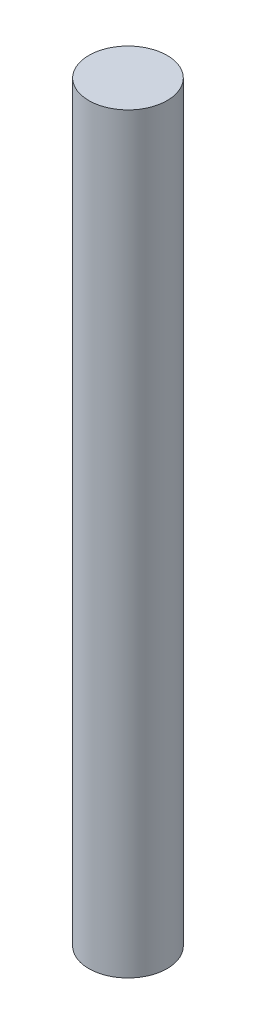
ISO-10303-21;
HEADER;
FILE_DESCRIPTION(('STEP AP214'),'2;1');
FILE_NAME('part.step','',(''),(''),'','','');
FILE_SCHEMA(('AUTOMOTIVE_DESIGN { 1 0 10303 214 1 1 1 1 }'));
ENDSEC;
DATA;
#1=APPLICATION_CONTEXT('core data for automotive mechanical design processes');
#2=APPLICATION_PROTOCOL_DEFINITION('international standard','automotive_design',2000,#1);
#3=PRODUCT_CONTEXT('',#1,'mechanical');
#4=PRODUCT('Part','Part','',(#3));
#5=PRODUCT_RELATED_PRODUCT_CATEGORY('part','',(#4));
#6=PRODUCT_DEFINITION_FORMATION('','',#4);
#7=PRODUCT_DEFINITION_CONTEXT('part definition',#1,'design');
#8=PRODUCT_DEFINITION('design','',#6,#7);
#9=PRODUCT_DEFINITION_SHAPE('','',#8);
#10=(LENGTH_UNIT() NAMED_UNIT(*) SI_UNIT(.MILLI.,.METRE.));
#11=(NAMED_UNIT(*) PLANE_ANGLE_UNIT() SI_UNIT($,.RADIAN.));
#12=(NAMED_UNIT(*) SI_UNIT($,.STERADIAN.) SOLID_ANGLE_UNIT());
#13=UNCERTAINTY_MEASURE_WITH_UNIT(LENGTH_MEASURE(1.E-05),#10,'distance_accuracy_value','');
#14=(GEOMETRIC_REPRESENTATION_CONTEXT(3) GLOBAL_UNCERTAINTY_ASSIGNED_CONTEXT((#13)) GLOBAL_UNIT_ASSIGNED_CONTEXT((#10,
#11,#12)) REPRESENTATION_CONTEXT('',''));
#15=CARTESIAN_POINT('',(0.,0.,0.));
#16=DIRECTION('',(0.,0.,1.));
#17=DIRECTION('',(1.,0.,0.));
#18=AXIS2_PLACEMENT_3D('',#15,#16,#17);
#19=CARTESIAN_POINT('',(0.,240.,0.));
#20=DIRECTION('',(0.,-1.,0.));
#21=DIRECTION('',(0.,0.,-1.));
#22=AXIS2_PLACEMENT_3D('',#19,#20,#21);
#23=CYLINDRICAL_SURFACE('',#22,12.5);
#24=CARTESIAN_POINT('',(0.,240.,0.));
#25=DIRECTION('',(0.,1.,0.));
#26=DIRECTION('',(0.,0.,1.));
#27=AXIS2_PLACEMENT_3D('',#24,#25,#26);
#28=CIRCLE('',#27,12.5);
#29=CARTESIAN_POINT('',(0.,240.,12.5));
#30=VERTEX_POINT('',#29);
#31=EDGE_CURVE('E10',#30,#30,#28,.T.);
#32=ORIENTED_EDGE('',*,*,#31,.F.);
#33=EDGE_LOOP('',(#32));
#34=FACE_BOUND('',#33,.T.);
#35=CARTESIAN_POINT('',(0.,0.,0.));
#36=DIRECTION('',(0.,1.,0.));
#37=DIRECTION('',(0.,0.,1.));
#38=AXIS2_PLACEMENT_3D('',#35,#36,#37);
#39=CIRCLE('',#38,12.5);
#40=CARTESIAN_POINT('',(0.,0.,12.5));
#41=VERTEX_POINT('',#40);
#42=EDGE_CURVE('E34',#41,#41,#39,.T.);
#43=ORIENTED_EDGE('',*,*,#42,.T.);
#44=EDGE_LOOP('',(#43));
#45=FACE_BOUND('',#44,.T.);
#46=ADVANCED_FACE('F31',(#34,#45),#23,.T.);
#47=CARTESIAN_POINT('',(0.,240.,0.));
#48=DIRECTION('',(0.,1.,0.));
#49=DIRECTION('',(0.,0.,1.));
#50=AXIS2_PLACEMENT_3D('',#47,#48,#49);
#51=PLANE('',#50);
#52=ORIENTED_EDGE('',*,*,#31,.T.);
#53=EDGE_LOOP('',(#52));
#54=FACE_BOUND('',#53,.T.);
#55=ADVANCED_FACE('F46',(#54),#51,.T.);
#56=CARTESIAN_POINT('',(0.,0.,0.));
#57=DIRECTION('',(0.,1.,0.));
#58=DIRECTION('',(0.,0.,1.));
#59=AXIS2_PLACEMENT_3D('',#56,#57,#58);
#60=PLANE('',#59);
#61=ORIENTED_EDGE('',*,*,#42,.F.);
#62=EDGE_LOOP('',(#61));
#63=FACE_BOUND('',#62,.T.);
#64=ADVANCED_FACE('F44',(#63),#60,.F.);
#65=CLOSED_SHELL('',(#46,#55,#64));
#66=MANIFOLD_SOLID_BREP('B2',#65);
#67=ADVANCED_BREP_SHAPE_REPRESENTATION('',(#18,#66),#14);
#68=SHAPE_DEFINITION_REPRESENTATION(#9,#67);
ENDSEC;
END-ISO-10303-21;
